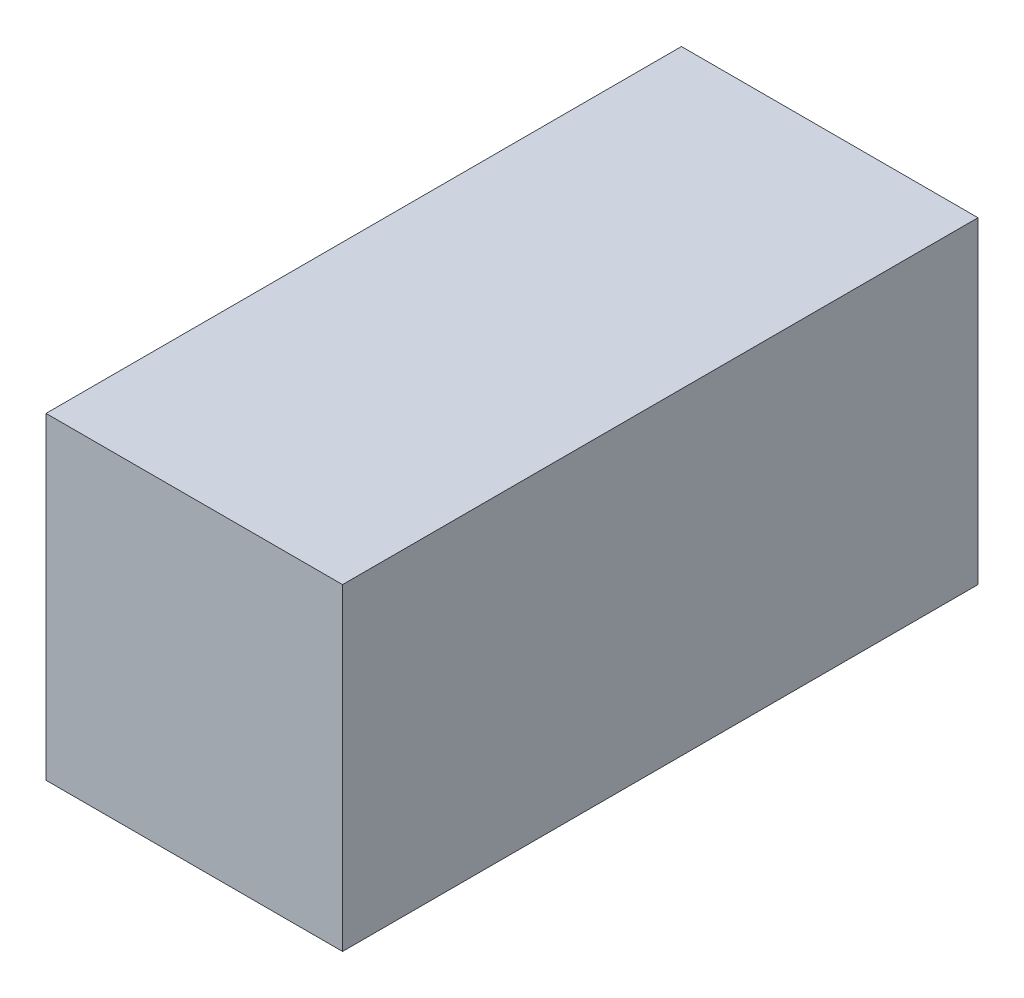
ISO-10303-21;
HEADER;
FILE_DESCRIPTION(('STEP AP214'),'2;1');
FILE_NAME('part.step','',(''),(''),'','','');
FILE_SCHEMA(('AUTOMOTIVE_DESIGN { 1 0 10303 214 1 1 1 1 }'));
ENDSEC;
DATA;
#1=APPLICATION_CONTEXT('core data for automotive mechanical design processes');
#2=APPLICATION_PROTOCOL_DEFINITION('international standard','automotive_design',2000,#1);
#3=PRODUCT_CONTEXT('',#1,'mechanical');
#4=PRODUCT('Part','Part','',(#3));
#5=PRODUCT_RELATED_PRODUCT_CATEGORY('part','',(#4));
#6=PRODUCT_DEFINITION_FORMATION('','',#4);
#7=PRODUCT_DEFINITION_CONTEXT('part definition',#1,'design');
#8=PRODUCT_DEFINITION('design','',#6,#7);
#9=PRODUCT_DEFINITION_SHAPE('','',#8);
#10=(LENGTH_UNIT() NAMED_UNIT(*) SI_UNIT(.MILLI.,.METRE.));
#11=(NAMED_UNIT(*) PLANE_ANGLE_UNIT() SI_UNIT($,.RADIAN.));
#12=(NAMED_UNIT(*) SI_UNIT($,.STERADIAN.) SOLID_ANGLE_UNIT());
#13=UNCERTAINTY_MEASURE_WITH_UNIT(LENGTH_MEASURE(1.E-05),#10,'distance_accuracy_value','');
#14=(GEOMETRIC_REPRESENTATION_CONTEXT(3) GLOBAL_UNCERTAINTY_ASSIGNED_CONTEXT((#13)) GLOBAL_UNIT_ASSIGNED_CONTEXT((#10,
#11,#12)) REPRESENTATION_CONTEXT('',''));
#15=CARTESIAN_POINT('',(0.,0.,0.));
#16=DIRECTION('',(0.,0.,1.));
#17=DIRECTION('',(1.,0.,0.));
#18=AXIS2_PLACEMENT_3D('',#15,#16,#17);
#19=CARTESIAN_POINT('',(80.,405.,-400.));
#20=DIRECTION('',(-1.,0.,0.));
#21=DIRECTION('',(0.,0.,1.));
#22=AXIS2_PLACEMENT_3D('',#19,#20,#21);
#23=PLANE('',#22);
#24=DIRECTION('',(0.,-1.,0.));
#25=VECTOR('',#24,1.);
#26=CARTESIAN_POINT('',(80.,405.,-100.));
#27=LINE('',#26,#25);
#28=CARTESIAN_POINT('',(80.,555.,-100.));
#29=VERTEX_POINT('',#28);
#30=CARTESIAN_POINT('',(80.,405.,-100.));
#31=VERTEX_POINT('',#30);
#32=EDGE_CURVE('E103',#29,#31,#27,.T.);
#33=ORIENTED_EDGE('',*,*,#32,.F.);
#34=DIRECTION('',(0.,0.,1.));
#35=VECTOR('',#34,1.);
#36=CARTESIAN_POINT('',(80.,555.,-400.));
#37=LINE('',#36,#35);
#38=CARTESIAN_POINT('',(80.,555.,-400.));
#39=VERTEX_POINT('',#38);
#40=EDGE_CURVE('E11',#39,#29,#37,.T.);
#41=ORIENTED_EDGE('',*,*,#40,.F.);
#42=DIRECTION('',(0.,-1.,0.));
#43=VECTOR('',#42,1.);
#44=CARTESIAN_POINT('',(80.,405.,-400.));
#45=LINE('',#44,#43);
#46=CARTESIAN_POINT('',(80.,405.,-400.));
#47=VERTEX_POINT('',#46);
#48=EDGE_CURVE('E97',#39,#47,#45,.T.);
#49=ORIENTED_EDGE('',*,*,#48,.T.);
#50=DIRECTION('',(0.,0.,1.));
#51=VECTOR('',#50,1.);
#52=CARTESIAN_POINT('',(80.,405.,-400.));
#53=LINE('',#52,#51);
#54=EDGE_CURVE('E42',#47,#31,#53,.T.);
#55=ORIENTED_EDGE('',*,*,#54,.T.);
#56=EDGE_LOOP('',(#33,#41,#49,#55));
#57=FACE_BOUND('',#56,.T.);
#58=ADVANCED_FACE('F39',(#57),#23,.T.);
#59=CARTESIAN_POINT('',(80.,555.,-400.));
#60=DIRECTION('',(0.,1.,0.));
#61=DIRECTION('',(0.,0.,1.));
#62=AXIS2_PLACEMENT_3D('',#59,#60,#61);
#63=PLANE('',#62);
#64=DIRECTION('',(-1.,0.,0.));
#65=VECTOR('',#64,1.);
#66=CARTESIAN_POINT('',(80.,555.,-100.));
#67=LINE('',#66,#65);
#68=CARTESIAN_POINT('',(220.,555.,-100.));
#69=VERTEX_POINT('',#68);
#70=EDGE_CURVE('E99',#69,#29,#67,.T.);
#71=ORIENTED_EDGE('',*,*,#70,.F.);
#72=DIRECTION('',(0.,0.,1.));
#73=VECTOR('',#72,1.);
#74=CARTESIAN_POINT('',(220.,555.,-400.));
#75=LINE('',#74,#73);
#76=CARTESIAN_POINT('',(220.,555.,-400.));
#77=VERTEX_POINT('',#76);
#78=EDGE_CURVE('E48',#77,#69,#75,.T.);
#79=ORIENTED_EDGE('',*,*,#78,.F.);
#80=DIRECTION('',(-1.,0.,0.));
#81=VECTOR('',#80,1.);
#82=CARTESIAN_POINT('',(80.,555.,-400.));
#83=LINE('',#82,#81);
#84=EDGE_CURVE('E94',#77,#39,#83,.T.);
#85=ORIENTED_EDGE('',*,*,#84,.T.);
#86=ORIENTED_EDGE('',*,*,#40,.T.);
#87=EDGE_LOOP('',(#71,#79,#85,#86));
#88=FACE_BOUND('',#87,.T.);
#89=ADVANCED_FACE('F113',(#88),#63,.T.);
#90=CARTESIAN_POINT('',(220.,405.,-400.));
#91=DIRECTION('',(1.,0.,0.));
#92=DIRECTION('',(0.,0.,-1.));
#93=AXIS2_PLACEMENT_3D('',#90,#91,#92);
#94=PLANE('',#93);
#95=DIRECTION('',(0.,1.,0.));
#96=VECTOR('',#95,1.);
#97=CARTESIAN_POINT('',(220.,405.,-100.));
#98=LINE('',#97,#96);
#99=CARTESIAN_POINT('',(220.,405.,-100.));
#100=VERTEX_POINT('',#99);
#101=EDGE_CURVE('E89',#100,#69,#98,.T.);
#102=ORIENTED_EDGE('',*,*,#101,.F.);
#103=DIRECTION('',(0.,0.,1.));
#104=VECTOR('',#103,1.);
#105=CARTESIAN_POINT('',(220.,405.,-400.));
#106=LINE('',#105,#104);
#107=CARTESIAN_POINT('',(220.,405.,-400.));
#108=VERTEX_POINT('',#107);
#109=EDGE_CURVE('E84',#108,#100,#106,.T.);
#110=ORIENTED_EDGE('',*,*,#109,.F.);
#111=DIRECTION('',(0.,1.,0.));
#112=VECTOR('',#111,1.);
#113=CARTESIAN_POINT('',(220.,405.,-400.));
#114=LINE('',#113,#112);
#115=EDGE_CURVE('E87',#108,#77,#114,.T.);
#116=ORIENTED_EDGE('',*,*,#115,.T.);
#117=ORIENTED_EDGE('',*,*,#78,.T.);
#118=EDGE_LOOP('',(#102,#110,#116,#117));
#119=FACE_BOUND('',#118,.T.);
#120=ADVANCED_FACE('F86',(#119),#94,.T.);
#121=CARTESIAN_POINT('',(80.,405.,-400.));
#122=DIRECTION('',(0.,-1.,0.));
#123=DIRECTION('',(0.,0.,-1.));
#124=AXIS2_PLACEMENT_3D('',#121,#122,#123);
#125=PLANE('',#124);
#126=DIRECTION('',(1.,0.,0.));
#127=VECTOR('',#126,1.);
#128=CARTESIAN_POINT('',(80.,405.,-100.));
#129=LINE('',#128,#127);
#130=EDGE_CURVE('E106',#31,#100,#129,.T.);
#131=ORIENTED_EDGE('',*,*,#130,.F.);
#132=ORIENTED_EDGE('',*,*,#54,.F.);
#133=DIRECTION('',(1.,0.,0.));
#134=VECTOR('',#133,1.);
#135=CARTESIAN_POINT('',(80.,405.,-400.));
#136=LINE('',#135,#134);
#137=EDGE_CURVE('E93',#47,#108,#136,.T.);
#138=ORIENTED_EDGE('',*,*,#137,.T.);
#139=ORIENTED_EDGE('',*,*,#109,.T.);
#140=EDGE_LOOP('',(#131,#132,#138,#139));
#141=FACE_BOUND('',#140,.T.);
#142=ADVANCED_FACE('F96',(#141),#125,.T.);
#143=CARTESIAN_POINT('',(0.,0.,-400.));
#144=DIRECTION('',(0.,0.,-1.));
#145=DIRECTION('',(-1.,0.,0.));
#146=AXIS2_PLACEMENT_3D('',#143,#144,#145);
#147=PLANE('',#146);
#148=ORIENTED_EDGE('',*,*,#48,.F.);
#149=ORIENTED_EDGE('',*,*,#84,.F.);
#150=ORIENTED_EDGE('',*,*,#115,.F.);
#151=ORIENTED_EDGE('',*,*,#137,.F.);
#152=EDGE_LOOP('',(#148,#149,#150,#151));
#153=FACE_BOUND('',#152,.T.);
#154=ADVANCED_FACE('F92',(#153),#147,.T.);
#155=CARTESIAN_POINT('',(0.,0.,-100.));
#156=DIRECTION('',(0.,0.,-1.));
#157=DIRECTION('',(-1.,0.,0.));
#158=AXIS2_PLACEMENT_3D('',#155,#156,#157);
#159=PLANE('',#158);
#160=ORIENTED_EDGE('',*,*,#32,.T.);
#161=ORIENTED_EDGE('',*,*,#130,.T.);
#162=ORIENTED_EDGE('',*,*,#101,.T.);
#163=ORIENTED_EDGE('',*,*,#70,.T.);
#164=EDGE_LOOP('',(#160,#161,#162,#163));
#165=FACE_BOUND('',#164,.T.);
#166=ADVANCED_FACE('F112',(#165),#159,.F.);
#167=CLOSED_SHELL('',(#58,#89,#120,#142,#154,#166));
#168=MANIFOLD_SOLID_BREP('B2',#167);
#169=ADVANCED_BREP_SHAPE_REPRESENTATION('',(#18,#168),#14);
#170=SHAPE_DEFINITION_REPRESENTATION(#9,#169);
ENDSEC;
END-ISO-10303-21;
